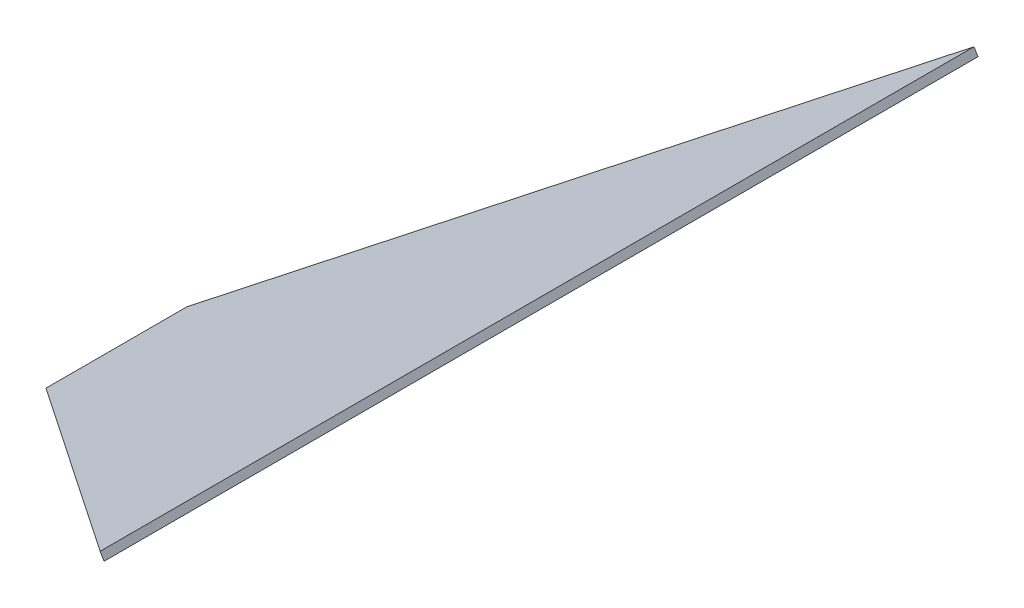
ISO-10303-21;
HEADER;
FILE_DESCRIPTION(('STEP AP214'),'2;1');
FILE_NAME('part.step','',(''),(''),'','','');
FILE_SCHEMA(('AUTOMOTIVE_DESIGN { 1 0 10303 214 1 1 1 1 }'));
ENDSEC;
DATA;
#1=APPLICATION_CONTEXT('core data for automotive mechanical design processes');
#2=APPLICATION_PROTOCOL_DEFINITION('international standard','automotive_design',2000,#1);
#3=PRODUCT_CONTEXT('',#1,'mechanical');
#4=PRODUCT('Part','Part','',(#3));
#5=PRODUCT_RELATED_PRODUCT_CATEGORY('part','',(#4));
#6=PRODUCT_DEFINITION_FORMATION('','',#4);
#7=PRODUCT_DEFINITION_CONTEXT('part definition',#1,'design');
#8=PRODUCT_DEFINITION('design','',#6,#7);
#9=PRODUCT_DEFINITION_SHAPE('','',#8);
#10=(LENGTH_UNIT() NAMED_UNIT(*) SI_UNIT(.MILLI.,.METRE.));
#11=(NAMED_UNIT(*) PLANE_ANGLE_UNIT() SI_UNIT($,.RADIAN.));
#12=(NAMED_UNIT(*) SI_UNIT($,.STERADIAN.) SOLID_ANGLE_UNIT());
#13=UNCERTAINTY_MEASURE_WITH_UNIT(LENGTH_MEASURE(1.E-05),#10,'distance_accuracy_value','');
#14=(GEOMETRIC_REPRESENTATION_CONTEXT(3) GLOBAL_UNCERTAINTY_ASSIGNED_CONTEXT((#13)) GLOBAL_UNIT_ASSIGNED_CONTEXT((#10,
#11,#12)) REPRESENTATION_CONTEXT('',''));
#15=CARTESIAN_POINT('',(0.,0.,0.));
#16=DIRECTION('',(0.,0.,1.));
#17=DIRECTION('',(1.,0.,0.));
#18=AXIS2_PLACEMENT_3D('',#15,#16,#17);
#19=CARTESIAN_POINT('',(385.585332177977,246.65988906546,711.2));
#20=DIRECTION('',(-0.857582250473721,-0.514346851523783,0.));
#21=DIRECTION('',(0.514346851523783,-0.857582250473721,0.));
#22=AXIS2_PLACEMENT_3D('',#19,#20,#21);
#23=PLANE('',#22);
#24=DIRECTION('',(0.,0.,-1.));
#25=VECTOR('',#24,1.);
#26=CARTESIAN_POINT('',(385.585332177977,246.65988906546,711.2));
#27=LINE('',#26,#25);
#28=CARTESIAN_POINT('',(385.585332177977,246.65988906546,707.582940077511));
#29=VERTEX_POINT('',#28);
#30=CARTESIAN_POINT('',(385.585332177977,246.65988906546,3.61705992248951));
#31=VERTEX_POINT('',#30);
#32=EDGE_CURVE('E84',#29,#31,#27,.T.);
#33=ORIENTED_EDGE('',*,*,#32,.F.);
#34=DIRECTION('',(-0.514346851523785,0.857582250473719,0.));
#35=VECTOR('',#34,1.);
#36=CARTESIAN_POINT('',(478.43044922822,91.8571053222388,707.582940077511));
#37=LINE('',#36,#35);
#38=CARTESIAN_POINT('',(388.8,241.3,707.582940077511));
#39=VERTEX_POINT('',#38);
#40=EDGE_CURVE('E70',#39,#29,#37,.T.);
#41=ORIENTED_EDGE('',*,*,#40,.F.);
#42=DIRECTION('',(0.,0.,-1.));
#43=VECTOR('',#42,1.);
#44=CARTESIAN_POINT('',(388.8,241.3,711.2));
#45=LINE('',#44,#43);
#46=CARTESIAN_POINT('',(388.8,241.3,3.61705992248962));
#47=VERTEX_POINT('',#46);
#48=EDGE_CURVE('E94',#39,#47,#45,.T.);
#49=ORIENTED_EDGE('',*,*,#48,.T.);
#50=DIRECTION('',(-0.514346851523785,0.857582250473719,0.));
#51=VECTOR('',#50,1.);
#52=CARTESIAN_POINT('',(478.43044922822,91.8571053222388,3.61705992248951));
#53=LINE('',#52,#51);
#54=EDGE_CURVE('E54',#47,#31,#53,.T.);
#55=ORIENTED_EDGE('',*,*,#54,.T.);
#56=EDGE_LOOP('',(#33,#41,#49,#55));
#57=FACE_BOUND('',#56,.T.);
#58=ADVANCED_FACE('F33',(#57),#23,.F.);
#59=CARTESIAN_POINT('',(46.7853321779767,43.4598890654619,711.2));
#60=DIRECTION('',(0.514346851523786,-0.857582250473719,0.));
#61=DIRECTION('',(0.857582250473719,0.514346851523786,0.));
#62=AXIS2_PLACEMENT_3D('',#59,#60,#61);
#63=PLANE('',#62);
#64=DIRECTION('',(0.,0.,-1.));
#65=VECTOR('',#64,1.);
#66=CARTESIAN_POINT('',(46.7853321779767,43.4598890654619,711.2));
#67=LINE('',#66,#65);
#68=CARTESIAN_POINT('',(46.7853321779766,43.4598890654619,412.372137738753));
#69=VERTEX_POINT('',#68);
#70=CARTESIAN_POINT('',(46.7853321779766,43.4598890654619,298.827862261247));
#71=VERTEX_POINT('',#70);
#72=EDGE_CURVE('E86',#69,#71,#67,.T.);
#73=ORIENTED_EDGE('',*,*,#72,.F.);
#74=DIRECTION('',(-0.68697227223074,-0.412021150287147,-0.598588062779563));
#75=VECTOR('',#74,1.);
#76=CARTESIAN_POINT('',(46.7853321779766,43.4598890654619,412.372137738753));
#77=LINE('',#76,#75);
#78=EDGE_CURVE('E73',#29,#69,#77,.T.);
#79=ORIENTED_EDGE('',*,*,#78,.F.);
#80=ORIENTED_EDGE('',*,*,#32,.T.);
#81=DIRECTION('',(0.68697227223074,0.412021150287147,-0.598588062779563));
#82=VECTOR('',#81,1.);
#83=CARTESIAN_POINT('',(46.7853321779766,43.4598890654619,298.827862261247));
#84=LINE('',#83,#82);
#85=EDGE_CURVE('E98',#71,#31,#84,.T.);
#86=ORIENTED_EDGE('',*,*,#85,.F.);
#87=EDGE_LOOP('',(#73,#79,#80,#86));
#88=FACE_BOUND('',#87,.T.);
#89=ADVANCED_FACE('F82',(#88),#63,.F.);
#90=CARTESIAN_POINT('',(50.0000000000003,38.1000000000011,711.2));
#91=DIRECTION('',(0.857582250473719,0.514346851523786,0.));
#92=DIRECTION('',(-0.514346851523786,0.857582250473719,0.));
#93=AXIS2_PLACEMENT_3D('',#90,#91,#92);
#94=PLANE('',#93);
#95=DIRECTION('',(0.,0.,-1.));
#96=VECTOR('',#95,1.);
#97=CARTESIAN_POINT('',(50.0000000000003,38.1000000000011,711.2));
#98=LINE('',#97,#96);
#99=CARTESIAN_POINT('',(50.0000000000003,38.1000000000011,412.372137738753));
#100=VERTEX_POINT('',#99);
#101=CARTESIAN_POINT('',(50.0000000000003,38.1000000000011,298.827862261247));
#102=VERTEX_POINT('',#101);
#103=EDGE_CURVE('E89',#100,#102,#98,.T.);
#104=ORIENTED_EDGE('',*,*,#103,.F.);
#105=DIRECTION('',(-0.514346851523785,0.857582250473719,0.));
#106=VECTOR('',#105,1.);
#107=CARTESIAN_POINT('',(139.63044922822,-111.34289467776,412.372137738753));
#108=LINE('',#107,#106);
#109=EDGE_CURVE('E47',#100,#69,#108,.T.);
#110=ORIENTED_EDGE('',*,*,#109,.T.);
#111=ORIENTED_EDGE('',*,*,#72,.T.);
#112=DIRECTION('',(-0.514346851523785,0.857582250473719,0.));
#113=VECTOR('',#112,1.);
#114=CARTESIAN_POINT('',(139.63044922822,-111.34289467776,298.827862261247));
#115=LINE('',#114,#113);
#116=EDGE_CURVE('E96',#102,#71,#115,.T.);
#117=ORIENTED_EDGE('',*,*,#116,.F.);
#118=EDGE_LOOP('',(#104,#110,#111,#117));
#119=FACE_BOUND('',#118,.T.);
#120=ADVANCED_FACE('F103',(#119),#94,.F.);
#121=CARTESIAN_POINT('',(50.0000000000003,38.1000000000011,711.2));
#122=DIRECTION('',(-0.514346851523785,0.857582250473719,0.));
#123=DIRECTION('',(-0.857582250473719,-0.514346851523785,0.));
#124=AXIS2_PLACEMENT_3D('',#121,#122,#123);
#125=PLANE('',#124);
#126=ORIENTED_EDGE('',*,*,#48,.F.);
#127=DIRECTION('',(-0.68697227223074,-0.412021150287147,-0.598588062779563));
#128=VECTOR('',#127,1.);
#129=CARTESIAN_POINT('',(172.882021738645,111.800197217511,519.444452468605));
#130=LINE('',#129,#128);
#131=EDGE_CURVE('E11',#39,#100,#130,.T.);
#132=ORIENTED_EDGE('',*,*,#131,.T.);
#133=ORIENTED_EDGE('',*,*,#103,.T.);
#134=DIRECTION('',(0.68697227223074,0.412021150287147,-0.598588062779563));
#135=VECTOR('',#134,1.);
#136=CARTESIAN_POINT('',(-119.572949491987,-63.6037288570576,446.583961654632));
#137=LINE('',#136,#135);
#138=EDGE_CURVE('E40',#102,#47,#137,.T.);
#139=ORIENTED_EDGE('',*,*,#138,.T.);
#140=EDGE_LOOP('',(#126,#132,#133,#139));
#141=FACE_BOUND('',#140,.T.);
#142=ADVANCED_FACE('F106',(#141),#125,.F.);
#143=CARTESIAN_POINT('',(139.63044922822,-111.34289467776,298.827862261247));
#144=DIRECTION('',(0.513338497985201,0.30788188545039,0.801057008644085));
#145=DIRECTION('',(0.841955336923125,0.,-0.53954722742932));
#146=AXIS2_PLACEMENT_3D('',#143,#144,#145);
#147=PLANE('',#146);
#148=ORIENTED_EDGE('',*,*,#116,.T.);
#149=ORIENTED_EDGE('',*,*,#85,.T.);
#150=ORIENTED_EDGE('',*,*,#54,.F.);
#151=ORIENTED_EDGE('',*,*,#138,.F.);
#152=EDGE_LOOP('',(#148,#149,#150,#151));
#153=FACE_BOUND('',#152,.T.);
#154=ADVANCED_FACE('F107',(#153),#147,.F.);
#155=CARTESIAN_POINT('',(139.63044922822,-111.34289467776,412.372137738753));
#156=DIRECTION('',(0.513338497985201,0.30788188545039,-0.801057008644085));
#157=DIRECTION('',(-0.841955336923125,0.,-0.53954722742932));
#158=AXIS2_PLACEMENT_3D('',#155,#156,#157);
#159=PLANE('',#158);
#160=ORIENTED_EDGE('',*,*,#40,.T.);
#161=ORIENTED_EDGE('',*,*,#78,.T.);
#162=ORIENTED_EDGE('',*,*,#109,.F.);
#163=ORIENTED_EDGE('',*,*,#131,.F.);
#164=EDGE_LOOP('',(#160,#161,#162,#163));
#165=FACE_BOUND('',#164,.T.);
#166=ADVANCED_FACE('F72',(#165),#159,.F.);
#167=CLOSED_SHELL('',(#58,#89,#120,#142,#154,#166));
#168=MANIFOLD_SOLID_BREP('B2',#167);
#169=ADVANCED_BREP_SHAPE_REPRESENTATION('',(#18,#168),#14);
#170=SHAPE_DEFINITION_REPRESENTATION(#9,#169);
ENDSEC;
END-ISO-10303-21;
